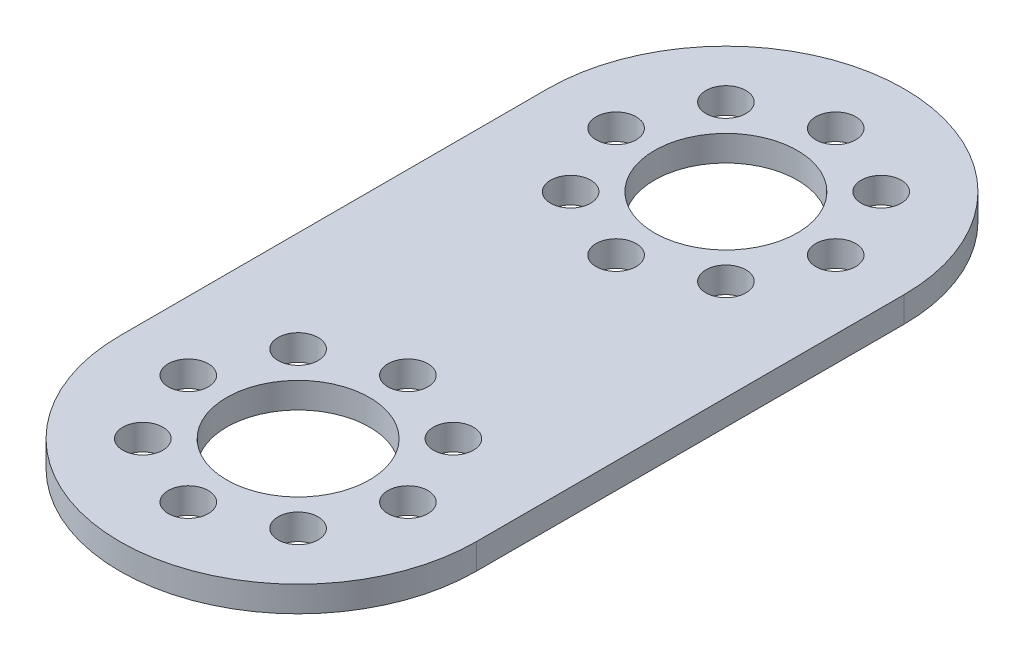
ISO-10303-21;
HEADER;
FILE_DESCRIPTION(('STEP AP214'),'2;1');
FILE_NAME('part.step','',(''),(''),'','','');
FILE_SCHEMA(('AUTOMOTIVE_DESIGN { 1 0 10303 214 1 1 1 1 }'));
ENDSEC;
DATA;
#1=APPLICATION_CONTEXT('core data for automotive mechanical design processes');
#2=APPLICATION_PROTOCOL_DEFINITION('international standard','automotive_design',2000,#1);
#3=PRODUCT_CONTEXT('',#1,'mechanical');
#4=PRODUCT('Part','Part','',(#3));
#5=PRODUCT_RELATED_PRODUCT_CATEGORY('part','',(#4));
#6=PRODUCT_DEFINITION_FORMATION('','',#4);
#7=PRODUCT_DEFINITION_CONTEXT('part definition',#1,'design');
#8=PRODUCT_DEFINITION('design','',#6,#7);
#9=PRODUCT_DEFINITION_SHAPE('','',#8);
#10=(LENGTH_UNIT() NAMED_UNIT(*) SI_UNIT(.MILLI.,.METRE.));
#11=(NAMED_UNIT(*) PLANE_ANGLE_UNIT() SI_UNIT($,.RADIAN.));
#12=(NAMED_UNIT(*) SI_UNIT($,.STERADIAN.) SOLID_ANGLE_UNIT());
#13=UNCERTAINTY_MEASURE_WITH_UNIT(LENGTH_MEASURE(1.E-05),#10,'distance_accuracy_value','');
#14=(GEOMETRIC_REPRESENTATION_CONTEXT(3) GLOBAL_UNCERTAINTY_ASSIGNED_CONTEXT((#13)) GLOBAL_UNIT_ASSIGNED_CONTEXT((#10,
#11,#12)) REPRESENTATION_CONTEXT('',''));
#15=CARTESIAN_POINT('',(0.,0.,0.));
#16=DIRECTION('',(0.,0.,1.));
#17=DIRECTION('',(1.,0.,0.));
#18=AXIS2_PLACEMENT_3D('',#15,#16,#17);
#19=CARTESIAN_POINT('',(0.,2.286,-19.05));
#20=DIRECTION('',(0.,-1.,0.));
#21=DIRECTION('',(0.,0.,-1.));
#22=AXIS2_PLACEMENT_3D('',#19,#20,#21);
#23=CYLINDRICAL_SURFACE('',#22,15.875);
#24=CARTESIAN_POINT('',(0.,0.,-19.05));
#25=DIRECTION('',(0.,-1.,0.));
#26=DIRECTION('',(0.,0.,-1.));
#27=AXIS2_PLACEMENT_3D('',#24,#25,#26);
#28=CIRCLE('',#27,15.875);
#29=CARTESIAN_POINT('',(-15.875,0.,-19.05));
#30=VERTEX_POINT('',#29);
#31=CARTESIAN_POINT('',(15.875,0.,-19.05));
#32=VERTEX_POINT('',#31);
#33=EDGE_CURVE('E100',#30,#32,#28,.T.);
#34=ORIENTED_EDGE('',*,*,#33,.F.);
#35=DIRECTION('',(0.,-1.,0.));
#36=VECTOR('',#35,1.);
#37=CARTESIAN_POINT('',(-15.875,2.286,-19.05));
#38=LINE('',#37,#36);
#39=CARTESIAN_POINT('',(-15.875,2.286,-19.05));
#40=VERTEX_POINT('',#39);
#41=EDGE_CURVE('E11',#40,#30,#38,.T.);
#42=ORIENTED_EDGE('',*,*,#41,.F.);
#43=CARTESIAN_POINT('',(0.,2.286,-19.05));
#44=DIRECTION('',(0.,-1.,0.));
#45=DIRECTION('',(0.,0.,-1.));
#46=AXIS2_PLACEMENT_3D('',#43,#44,#45);
#47=CIRCLE('',#46,15.875);
#48=CARTESIAN_POINT('',(15.875,2.286,-19.05));
#49=VERTEX_POINT('',#48);
#50=EDGE_CURVE('E93',#40,#49,#47,.T.);
#51=ORIENTED_EDGE('',*,*,#50,.T.);
#52=DIRECTION('',(0.,-1.,0.));
#53=VECTOR('',#52,1.);
#54=CARTESIAN_POINT('',(15.875,2.286,-19.05));
#55=LINE('',#54,#53);
#56=EDGE_CURVE('E38',#49,#32,#55,.T.);
#57=ORIENTED_EDGE('',*,*,#56,.T.);
#58=EDGE_LOOP('',(#34,#42,#51,#57));
#59=FACE_BOUND('',#58,.T.);
#60=ADVANCED_FACE('F35',(#59),#23,.T.);
#61=CARTESIAN_POINT('',(-15.875,2.286,19.05));
#62=DIRECTION('',(-1.,0.,0.));
#63=DIRECTION('',(0.,0.,1.));
#64=AXIS2_PLACEMENT_3D('',#61,#62,#63);
#65=PLANE('',#64);
#66=DIRECTION('',(0.,0.,-1.));
#67=VECTOR('',#66,1.);
#68=CARTESIAN_POINT('',(-15.875,0.,19.05));
#69=LINE('',#68,#67);
#70=CARTESIAN_POINT('',(-15.875,0.,19.05));
#71=VERTEX_POINT('',#70);
#72=EDGE_CURVE('E95',#71,#30,#69,.T.);
#73=ORIENTED_EDGE('',*,*,#72,.F.);
#74=DIRECTION('',(0.,-1.,0.));
#75=VECTOR('',#74,1.);
#76=CARTESIAN_POINT('',(-15.875,2.286,19.05));
#77=LINE('',#76,#75);
#78=CARTESIAN_POINT('',(-15.875,2.286,19.05));
#79=VERTEX_POINT('',#78);
#80=EDGE_CURVE('E44',#79,#71,#77,.T.);
#81=ORIENTED_EDGE('',*,*,#80,.F.);
#82=DIRECTION('',(0.,0.,-1.));
#83=VECTOR('',#82,1.);
#84=CARTESIAN_POINT('',(-15.875,2.286,19.05));
#85=LINE('',#84,#83);
#86=EDGE_CURVE('E90',#79,#40,#85,.T.);
#87=ORIENTED_EDGE('',*,*,#86,.T.);
#88=ORIENTED_EDGE('',*,*,#41,.T.);
#89=EDGE_LOOP('',(#73,#81,#87,#88));
#90=FACE_BOUND('',#89,.T.);
#91=ADVANCED_FACE('F111',(#90),#65,.T.);
#92=CARTESIAN_POINT('',(0.,2.286,19.05));
#93=DIRECTION('',(0.,-1.,0.));
#94=DIRECTION('',(0.,0.,-1.));
#95=AXIS2_PLACEMENT_3D('',#92,#93,#94);
#96=CYLINDRICAL_SURFACE('',#95,15.875);
#97=CARTESIAN_POINT('',(0.,0.,19.05));
#98=DIRECTION('',(0.,-1.,0.));
#99=DIRECTION('',(0.,0.,-1.));
#100=AXIS2_PLACEMENT_3D('',#97,#98,#99);
#101=CIRCLE('',#100,15.875);
#102=CARTESIAN_POINT('',(15.875,0.,19.05));
#103=VERTEX_POINT('',#102);
#104=EDGE_CURVE('E85',#103,#71,#101,.T.);
#105=ORIENTED_EDGE('',*,*,#104,.F.);
#106=DIRECTION('',(0.,-1.,0.));
#107=VECTOR('',#106,1.);
#108=CARTESIAN_POINT('',(15.875,2.286,19.05));
#109=LINE('',#108,#107);
#110=CARTESIAN_POINT('',(15.875,2.286,19.05));
#111=VERTEX_POINT('',#110);
#112=EDGE_CURVE('E80',#111,#103,#109,.T.);
#113=ORIENTED_EDGE('',*,*,#112,.F.);
#114=CARTESIAN_POINT('',(0.,2.286,19.05));
#115=DIRECTION('',(0.,-1.,0.));
#116=DIRECTION('',(0.,0.,-1.));
#117=AXIS2_PLACEMENT_3D('',#114,#115,#116);
#118=CIRCLE('',#117,15.875);
#119=EDGE_CURVE('E83',#111,#79,#118,.T.);
#120=ORIENTED_EDGE('',*,*,#119,.T.);
#121=ORIENTED_EDGE('',*,*,#80,.T.);
#122=EDGE_LOOP('',(#105,#113,#120,#121));
#123=FACE_BOUND('',#122,.T.);
#124=ADVANCED_FACE('F82',(#123),#96,.T.);
#125=CARTESIAN_POINT('',(15.875,2.286,-19.05));
#126=DIRECTION('',(1.,0.,0.));
#127=DIRECTION('',(0.,0.,-1.));
#128=AXIS2_PLACEMENT_3D('',#125,#126,#127);
#129=PLANE('',#128);
#130=DIRECTION('',(0.,0.,1.));
#131=VECTOR('',#130,1.);
#132=CARTESIAN_POINT('',(15.875,0.,-19.05));
#133=LINE('',#132,#131);
#134=EDGE_CURVE('E103',#32,#103,#133,.T.);
#135=ORIENTED_EDGE('',*,*,#134,.F.);
#136=ORIENTED_EDGE('',*,*,#56,.F.);
#137=DIRECTION('',(0.,0.,1.));
#138=VECTOR('',#137,1.);
#139=CARTESIAN_POINT('',(15.875,2.286,-19.05));
#140=LINE('',#139,#138);
#141=EDGE_CURVE('E89',#49,#111,#140,.T.);
#142=ORIENTED_EDGE('',*,*,#141,.T.);
#143=ORIENTED_EDGE('',*,*,#112,.T.);
#144=EDGE_LOOP('',(#135,#136,#142,#143));
#145=FACE_BOUND('',#144,.T.);
#146=ADVANCED_FACE('F92',(#145),#129,.T.);
#147=CARTESIAN_POINT('',(0.,2.286,-19.05));
#148=DIRECTION('',(0.,-1.,0.));
#149=DIRECTION('',(0.,0.,-1.));
#150=AXIS2_PLACEMENT_3D('',#147,#148,#149);
#151=PLANE('',#150);
#152=CARTESIAN_POINT('',(6.91479721322333,2.286,-25.9647972132232));
#153=DIRECTION('',(0.,-1.,0.));
#154=DIRECTION('',(0.,0.,1.));
#155=AXIS2_PLACEMENT_3D('',#152,#153,#154);
#156=CIRCLE('',#155,1.78435);
#157=CARTESIAN_POINT('',(6.91479721322333,2.286,-24.1804472132232));
#158=VERTEX_POINT('',#157);
#159=EDGE_CURVE('E208',#158,#158,#156,.T.);
#160=ORIENTED_EDGE('',*,*,#159,.T.);
#161=EDGE_LOOP('',(#160));
#162=FACE_BOUND('',#161,.T.);
#163=CARTESIAN_POINT('',(1.04083408558608E-13,2.286,-28.829));
#164=DIRECTION('',(0.,-1.,0.));
#165=DIRECTION('',(0.,0.,1.));
#166=AXIS2_PLACEMENT_3D('',#163,#164,#165);
#167=CIRCLE('',#166,1.78435);
#168=CARTESIAN_POINT('',(1.04083408558608E-13,2.286,-27.04465));
#169=VERTEX_POINT('',#168);
#170=EDGE_CURVE('E216',#169,#169,#167,.T.);
#171=ORIENTED_EDGE('',*,*,#170,.T.);
#172=EDGE_LOOP('',(#171));
#173=FACE_BOUND('',#172,.T.);
#174=CARTESIAN_POINT('',(-6.91479721322319,2.286,-25.9647972132233));
#175=DIRECTION('',(0.,-1.,0.));
#176=DIRECTION('',(0.,0.,1.));
#177=AXIS2_PLACEMENT_3D('',#174,#175,#176);
#178=CIRCLE('',#177,1.78435);
#179=CARTESIAN_POINT('',(-6.91479721322319,2.286,-24.1804472132233));
#180=VERTEX_POINT('',#179);
#181=EDGE_CURVE('E222',#180,#180,#178,.T.);
#182=ORIENTED_EDGE('',*,*,#181,.T.);
#183=EDGE_LOOP('',(#182));
#184=FACE_BOUND('',#183,.T.);
#185=CARTESIAN_POINT('',(-9.779,2.286,-19.05));
#186=DIRECTION('',(0.,-1.,0.));
#187=DIRECTION('',(0.,0.,1.));
#188=AXIS2_PLACEMENT_3D('',#185,#186,#187);
#189=CIRCLE('',#188,1.78435);
#190=CARTESIAN_POINT('',(-9.779,2.286,-17.26565));
#191=VERTEX_POINT('',#190);
#192=EDGE_CURVE('E228',#191,#191,#189,.T.);
#193=ORIENTED_EDGE('',*,*,#192,.T.);
#194=EDGE_LOOP('',(#193));
#195=FACE_BOUND('',#194,.T.);
#196=CARTESIAN_POINT('',(-6.91479721322328,2.286,-12.1352027867768));
#197=DIRECTION('',(0.,-1.,0.));
#198=DIRECTION('',(0.,0.,1.));
#199=AXIS2_PLACEMENT_3D('',#196,#197,#198);
#200=CIRCLE('',#199,1.78435);
#201=CARTESIAN_POINT('',(-6.91479721322328,2.286,-10.3508527867768));
#202=VERTEX_POINT('',#201);
#203=EDGE_CURVE('E234',#202,#202,#200,.T.);
#204=ORIENTED_EDGE('',*,*,#203,.T.);
#205=EDGE_LOOP('',(#204));
#206=FACE_BOUND('',#205,.T.);
#207=CARTESIAN_POINT('',(0.,2.286,-9.271));
#208=DIRECTION('',(0.,-1.,0.));
#209=DIRECTION('',(0.,0.,1.));
#210=AXIS2_PLACEMENT_3D('',#207,#208,#209);
#211=CIRCLE('',#210,1.78435);
#212=CARTESIAN_POINT('',(0.,2.286,-7.48665));
#213=VERTEX_POINT('',#212);
#214=EDGE_CURVE('E240',#213,#213,#211,.T.);
#215=ORIENTED_EDGE('',*,*,#214,.T.);
#216=EDGE_LOOP('',(#215));
#217=FACE_BOUND('',#216,.T.);
#218=CARTESIAN_POINT('',(6.91479721322324,2.286,-12.1352027867767));
#219=DIRECTION('',(0.,-1.,0.));
#220=DIRECTION('',(0.,0.,1.));
#221=AXIS2_PLACEMENT_3D('',#218,#219,#220);
#222=CIRCLE('',#221,1.78435);
#223=CARTESIAN_POINT('',(6.91479721322324,2.286,-10.3508527867767));
#224=VERTEX_POINT('',#223);
#225=EDGE_CURVE('E246',#224,#224,#222,.T.);
#226=ORIENTED_EDGE('',*,*,#225,.T.);
#227=EDGE_LOOP('',(#226));
#228=FACE_BOUND('',#227,.T.);
#229=CARTESIAN_POINT('',(9.779,2.286,-19.05));
#230=DIRECTION('',(0.,-1.,0.));
#231=DIRECTION('',(0.,0.,1.));
#232=AXIS2_PLACEMENT_3D('',#229,#230,#231);
#233=CIRCLE('',#232,1.78435);
#234=CARTESIAN_POINT('',(9.779,2.286,-17.26565));
#235=VERTEX_POINT('',#234);
#236=EDGE_CURVE('E252',#235,#235,#233,.T.);
#237=ORIENTED_EDGE('',*,*,#236,.T.);
#238=EDGE_LOOP('',(#237));
#239=FACE_BOUND('',#238,.T.);
#240=CARTESIAN_POINT('',(6.91479721322333,2.286,25.9647972132232));
#241=DIRECTION('',(0.,-1.,0.));
#242=DIRECTION('',(0.,0.,1.));
#243=AXIS2_PLACEMENT_3D('',#240,#241,#242);
#244=CIRCLE('',#243,1.78435);
#245=CARTESIAN_POINT('',(6.91479721322333,2.286,27.7491472132232));
#246=VERTEX_POINT('',#245);
#247=EDGE_CURVE('E258',#246,#246,#244,.T.);
#248=ORIENTED_EDGE('',*,*,#247,.T.);
#249=EDGE_LOOP('',(#248));
#250=FACE_BOUND('',#249,.T.);
#251=CARTESIAN_POINT('',(1.04083408558608E-13,2.286,28.829));
#252=DIRECTION('',(0.,-1.,0.));
#253=DIRECTION('',(0.,0.,1.));
#254=AXIS2_PLACEMENT_3D('',#251,#252,#253);
#255=CIRCLE('',#254,1.78435);
#256=CARTESIAN_POINT('',(1.04083408558608E-13,2.286,30.61335));
#257=VERTEX_POINT('',#256);
#258=EDGE_CURVE('E264',#257,#257,#255,.T.);
#259=ORIENTED_EDGE('',*,*,#258,.T.);
#260=EDGE_LOOP('',(#259));
#261=FACE_BOUND('',#260,.T.);
#262=CARTESIAN_POINT('',(-6.91479721322319,2.286,25.9647972132233));
#263=DIRECTION('',(0.,-1.,0.));
#264=DIRECTION('',(0.,0.,1.));
#265=AXIS2_PLACEMENT_3D('',#262,#263,#264);
#266=CIRCLE('',#265,1.78435);
#267=CARTESIAN_POINT('',(-6.91479721322319,2.286,27.7491472132233));
#268=VERTEX_POINT('',#267);
#269=EDGE_CURVE('E270',#268,#268,#266,.T.);
#270=ORIENTED_EDGE('',*,*,#269,.T.);
#271=EDGE_LOOP('',(#270));
#272=FACE_BOUND('',#271,.T.);
#273=CARTESIAN_POINT('',(-9.779,2.286,19.05));
#274=DIRECTION('',(0.,-1.,0.));
#275=DIRECTION('',(0.,0.,1.));
#276=AXIS2_PLACEMENT_3D('',#273,#274,#275);
#277=CIRCLE('',#276,1.78435);
#278=CARTESIAN_POINT('',(-9.779,2.286,20.83435));
#279=VERTEX_POINT('',#278);
#280=EDGE_CURVE('E276',#279,#279,#277,.T.);
#281=ORIENTED_EDGE('',*,*,#280,.T.);
#282=EDGE_LOOP('',(#281));
#283=FACE_BOUND('',#282,.T.);
#284=CARTESIAN_POINT('',(-6.91479721322328,2.286,12.1352027867768));
#285=DIRECTION('',(0.,-1.,0.));
#286=DIRECTION('',(0.,0.,1.));
#287=AXIS2_PLACEMENT_3D('',#284,#285,#286);
#288=CIRCLE('',#287,1.78435);
#289=CARTESIAN_POINT('',(-6.91479721322328,2.286,13.9195527867768));
#290=VERTEX_POINT('',#289);
#291=EDGE_CURVE('E282',#290,#290,#288,.T.);
#292=ORIENTED_EDGE('',*,*,#291,.T.);
#293=EDGE_LOOP('',(#292));
#294=FACE_BOUND('',#293,.T.);
#295=CARTESIAN_POINT('',(0.,2.286,9.271));
#296=DIRECTION('',(0.,-1.,0.));
#297=DIRECTION('',(0.,0.,1.));
#298=AXIS2_PLACEMENT_3D('',#295,#296,#297);
#299=CIRCLE('',#298,1.78435);
#300=CARTESIAN_POINT('',(0.,2.286,11.05535));
#301=VERTEX_POINT('',#300);
#302=EDGE_CURVE('E288',#301,#301,#299,.T.);
#303=ORIENTED_EDGE('',*,*,#302,.T.);
#304=EDGE_LOOP('',(#303));
#305=FACE_BOUND('',#304,.T.);
#306=CARTESIAN_POINT('',(6.91479721322324,2.286,12.1352027867767));
#307=DIRECTION('',(0.,-1.,0.));
#308=DIRECTION('',(0.,0.,1.));
#309=AXIS2_PLACEMENT_3D('',#306,#307,#308);
#310=CIRCLE('',#309,1.78435);
#311=CARTESIAN_POINT('',(6.91479721322324,2.286,13.9195527867767));
#312=VERTEX_POINT('',#311);
#313=EDGE_CURVE('E294',#312,#312,#310,.T.);
#314=ORIENTED_EDGE('',*,*,#313,.T.);
#315=EDGE_LOOP('',(#314));
#316=FACE_BOUND('',#315,.T.);
#317=CARTESIAN_POINT('',(9.779,2.286,19.05));
#318=DIRECTION('',(0.,-1.,0.));
#319=DIRECTION('',(0.,0.,1.));
#320=AXIS2_PLACEMENT_3D('',#317,#318,#319);
#321=CIRCLE('',#320,1.78435);
#322=CARTESIAN_POINT('',(9.779,2.286,20.83435));
#323=VERTEX_POINT('',#322);
#324=EDGE_CURVE('E300',#323,#323,#321,.T.);
#325=ORIENTED_EDGE('',*,*,#324,.T.);
#326=EDGE_LOOP('',(#325));
#327=FACE_BOUND('',#326,.T.);
#328=CARTESIAN_POINT('',(0.,2.286,19.05));
#329=DIRECTION('',(0.,-1.,0.));
#330=DIRECTION('',(0.,0.,1.));
#331=AXIS2_PLACEMENT_3D('',#328,#329,#330);
#332=CIRCLE('',#331,6.3627);
#333=CARTESIAN_POINT('',(0.,2.286,25.4127));
#334=VERTEX_POINT('',#333);
#335=EDGE_CURVE('E306',#334,#334,#332,.T.);
#336=ORIENTED_EDGE('',*,*,#335,.T.);
#337=EDGE_LOOP('',(#336));
#338=FACE_BOUND('',#337,.T.);
#339=CARTESIAN_POINT('',(0.,2.286,-19.05));
#340=DIRECTION('',(0.,-1.,0.));
#341=DIRECTION('',(0.,0.,1.));
#342=AXIS2_PLACEMENT_3D('',#339,#340,#341);
#343=CIRCLE('',#342,6.3627);
#344=CARTESIAN_POINT('',(0.,2.286,-12.6873));
#345=VERTEX_POINT('',#344);
#346=EDGE_CURVE('E104',#345,#345,#343,.T.);
#347=ORIENTED_EDGE('',*,*,#346,.T.);
#348=EDGE_LOOP('',(#347));
#349=FACE_BOUND('',#348,.T.);
#350=ORIENTED_EDGE('',*,*,#50,.F.);
#351=ORIENTED_EDGE('',*,*,#86,.F.);
#352=ORIENTED_EDGE('',*,*,#119,.F.);
#353=ORIENTED_EDGE('',*,*,#141,.F.);
#354=EDGE_LOOP('',(#350,#351,#352,#353));
#355=FACE_BOUND('',#354,.T.);
#356=ADVANCED_FACE('F88',(#162,#173,#184,#195,#206,#217,#228,#239,#250,#261,#272,#283,#294,#305,
#316,#327,#338,#349,#355),#151,.F.);
#357=CARTESIAN_POINT('',(0.,0.,-19.05));
#358=DIRECTION('',(0.,-1.,0.));
#359=DIRECTION('',(0.,0.,-1.));
#360=AXIS2_PLACEMENT_3D('',#357,#358,#359);
#361=PLANE('',#360);
#362=CARTESIAN_POINT('',(6.91479721322333,0.,-25.9647972132232));
#363=DIRECTION('',(0.,-1.,0.));
#364=DIRECTION('',(0.,0.,1.));
#365=AXIS2_PLACEMENT_3D('',#362,#363,#364);
#366=CIRCLE('',#365,1.78435);
#367=CARTESIAN_POINT('',(6.91479721322333,0.,-24.1804472132232));
#368=VERTEX_POINT('',#367);
#369=EDGE_CURVE('E211',#368,#368,#366,.T.);
#370=ORIENTED_EDGE('',*,*,#369,.F.);
#371=EDGE_LOOP('',(#370));
#372=FACE_BOUND('',#371,.T.);
#373=CARTESIAN_POINT('',(1.04083408558608E-13,0.,-28.829));
#374=DIRECTION('',(0.,-1.,0.));
#375=DIRECTION('',(0.,0.,1.));
#376=AXIS2_PLACEMENT_3D('',#373,#374,#375);
#377=CIRCLE('',#376,1.78435);
#378=CARTESIAN_POINT('',(1.04083408558608E-13,0.,-27.04465));
#379=VERTEX_POINT('',#378);
#380=EDGE_CURVE('E213',#379,#379,#377,.T.);
#381=ORIENTED_EDGE('',*,*,#380,.F.);
#382=EDGE_LOOP('',(#381));
#383=FACE_BOUND('',#382,.T.);
#384=CARTESIAN_POINT('',(-6.91479721322319,0.,-25.9647972132233));
#385=DIRECTION('',(0.,-1.,0.));
#386=DIRECTION('',(0.,0.,1.));
#387=AXIS2_PLACEMENT_3D('',#384,#385,#386);
#388=CIRCLE('',#387,1.78435);
#389=CARTESIAN_POINT('',(-6.91479721322319,0.,-24.1804472132233));
#390=VERTEX_POINT('',#389);
#391=EDGE_CURVE('E219',#390,#390,#388,.T.);
#392=ORIENTED_EDGE('',*,*,#391,.F.);
#393=EDGE_LOOP('',(#392));
#394=FACE_BOUND('',#393,.T.);
#395=CARTESIAN_POINT('',(-9.779,0.,-19.05));
#396=DIRECTION('',(0.,-1.,0.));
#397=DIRECTION('',(0.,0.,1.));
#398=AXIS2_PLACEMENT_3D('',#395,#396,#397);
#399=CIRCLE('',#398,1.78435);
#400=CARTESIAN_POINT('',(-9.779,0.,-17.26565));
#401=VERTEX_POINT('',#400);
#402=EDGE_CURVE('E225',#401,#401,#399,.T.);
#403=ORIENTED_EDGE('',*,*,#402,.F.);
#404=EDGE_LOOP('',(#403));
#405=FACE_BOUND('',#404,.T.);
#406=CARTESIAN_POINT('',(-6.91479721322328,0.,-12.1352027867768));
#407=DIRECTION('',(0.,-1.,0.));
#408=DIRECTION('',(0.,0.,1.));
#409=AXIS2_PLACEMENT_3D('',#406,#407,#408);
#410=CIRCLE('',#409,1.78435);
#411=CARTESIAN_POINT('',(-6.91479721322328,0.,-10.3508527867768));
#412=VERTEX_POINT('',#411);
#413=EDGE_CURVE('E231',#412,#412,#410,.T.);
#414=ORIENTED_EDGE('',*,*,#413,.F.);
#415=EDGE_LOOP('',(#414));
#416=FACE_BOUND('',#415,.T.);
#417=CARTESIAN_POINT('',(0.,0.,-9.271));
#418=DIRECTION('',(0.,-1.,0.));
#419=DIRECTION('',(0.,0.,1.));
#420=AXIS2_PLACEMENT_3D('',#417,#418,#419);
#421=CIRCLE('',#420,1.78435);
#422=CARTESIAN_POINT('',(0.,0.,-7.48665));
#423=VERTEX_POINT('',#422);
#424=EDGE_CURVE('E237',#423,#423,#421,.T.);
#425=ORIENTED_EDGE('',*,*,#424,.F.);
#426=EDGE_LOOP('',(#425));
#427=FACE_BOUND('',#426,.T.);
#428=CARTESIAN_POINT('',(6.91479721322324,0.,-12.1352027867767));
#429=DIRECTION('',(0.,-1.,0.));
#430=DIRECTION('',(0.,0.,1.));
#431=AXIS2_PLACEMENT_3D('',#428,#429,#430);
#432=CIRCLE('',#431,1.78435);
#433=CARTESIAN_POINT('',(6.91479721322324,0.,-10.3508527867767));
#434=VERTEX_POINT('',#433);
#435=EDGE_CURVE('E243',#434,#434,#432,.T.);
#436=ORIENTED_EDGE('',*,*,#435,.F.);
#437=EDGE_LOOP('',(#436));
#438=FACE_BOUND('',#437,.T.);
#439=CARTESIAN_POINT('',(9.779,0.,-19.05));
#440=DIRECTION('',(0.,-1.,0.));
#441=DIRECTION('',(0.,0.,1.));
#442=AXIS2_PLACEMENT_3D('',#439,#440,#441);
#443=CIRCLE('',#442,1.78435);
#444=CARTESIAN_POINT('',(9.779,0.,-17.26565));
#445=VERTEX_POINT('',#444);
#446=EDGE_CURVE('E249',#445,#445,#443,.T.);
#447=ORIENTED_EDGE('',*,*,#446,.F.);
#448=EDGE_LOOP('',(#447));
#449=FACE_BOUND('',#448,.T.);
#450=CARTESIAN_POINT('',(6.91479721322333,0.,25.9647972132232));
#451=DIRECTION('',(0.,-1.,0.));
#452=DIRECTION('',(0.,0.,1.));
#453=AXIS2_PLACEMENT_3D('',#450,#451,#452);
#454=CIRCLE('',#453,1.78435);
#455=CARTESIAN_POINT('',(6.91479721322333,0.,27.7491472132232));
#456=VERTEX_POINT('',#455);
#457=EDGE_CURVE('E255',#456,#456,#454,.T.);
#458=ORIENTED_EDGE('',*,*,#457,.F.);
#459=EDGE_LOOP('',(#458));
#460=FACE_BOUND('',#459,.T.);
#461=CARTESIAN_POINT('',(1.04083408558608E-13,0.,28.829));
#462=DIRECTION('',(0.,-1.,0.));
#463=DIRECTION('',(0.,0.,1.));
#464=AXIS2_PLACEMENT_3D('',#461,#462,#463);
#465=CIRCLE('',#464,1.78435);
#466=CARTESIAN_POINT('',(1.04083408558608E-13,0.,30.61335));
#467=VERTEX_POINT('',#466);
#468=EDGE_CURVE('E261',#467,#467,#465,.T.);
#469=ORIENTED_EDGE('',*,*,#468,.F.);
#470=EDGE_LOOP('',(#469));
#471=FACE_BOUND('',#470,.T.);
#472=CARTESIAN_POINT('',(-6.91479721322319,0.,25.9647972132233));
#473=DIRECTION('',(0.,-1.,0.));
#474=DIRECTION('',(0.,0.,1.));
#475=AXIS2_PLACEMENT_3D('',#472,#473,#474);
#476=CIRCLE('',#475,1.78435);
#477=CARTESIAN_POINT('',(-6.91479721322319,0.,27.7491472132233));
#478=VERTEX_POINT('',#477);
#479=EDGE_CURVE('E267',#478,#478,#476,.T.);
#480=ORIENTED_EDGE('',*,*,#479,.F.);
#481=EDGE_LOOP('',(#480));
#482=FACE_BOUND('',#481,.T.);
#483=CARTESIAN_POINT('',(-9.779,0.,19.05));
#484=DIRECTION('',(0.,-1.,0.));
#485=DIRECTION('',(0.,0.,1.));
#486=AXIS2_PLACEMENT_3D('',#483,#484,#485);
#487=CIRCLE('',#486,1.78435);
#488=CARTESIAN_POINT('',(-9.779,0.,20.83435));
#489=VERTEX_POINT('',#488);
#490=EDGE_CURVE('E273',#489,#489,#487,.T.);
#491=ORIENTED_EDGE('',*,*,#490,.F.);
#492=EDGE_LOOP('',(#491));
#493=FACE_BOUND('',#492,.T.);
#494=CARTESIAN_POINT('',(-6.91479721322328,0.,12.1352027867768));
#495=DIRECTION('',(0.,-1.,0.));
#496=DIRECTION('',(0.,0.,1.));
#497=AXIS2_PLACEMENT_3D('',#494,#495,#496);
#498=CIRCLE('',#497,1.78435);
#499=CARTESIAN_POINT('',(-6.91479721322328,0.,13.9195527867768));
#500=VERTEX_POINT('',#499);
#501=EDGE_CURVE('E279',#500,#500,#498,.T.);
#502=ORIENTED_EDGE('',*,*,#501,.F.);
#503=EDGE_LOOP('',(#502));
#504=FACE_BOUND('',#503,.T.);
#505=CARTESIAN_POINT('',(0.,0.,9.271));
#506=DIRECTION('',(0.,-1.,0.));
#507=DIRECTION('',(0.,0.,1.));
#508=AXIS2_PLACEMENT_3D('',#505,#506,#507);
#509=CIRCLE('',#508,1.78435);
#510=CARTESIAN_POINT('',(0.,0.,11.05535));
#511=VERTEX_POINT('',#510);
#512=EDGE_CURVE('E285',#511,#511,#509,.T.);
#513=ORIENTED_EDGE('',*,*,#512,.F.);
#514=EDGE_LOOP('',(#513));
#515=FACE_BOUND('',#514,.T.);
#516=CARTESIAN_POINT('',(6.91479721322324,0.,12.1352027867767));
#517=DIRECTION('',(0.,-1.,0.));
#518=DIRECTION('',(0.,0.,1.));
#519=AXIS2_PLACEMENT_3D('',#516,#517,#518);
#520=CIRCLE('',#519,1.78435);
#521=CARTESIAN_POINT('',(6.91479721322324,0.,13.9195527867767));
#522=VERTEX_POINT('',#521);
#523=EDGE_CURVE('E291',#522,#522,#520,.T.);
#524=ORIENTED_EDGE('',*,*,#523,.F.);
#525=EDGE_LOOP('',(#524));
#526=FACE_BOUND('',#525,.T.);
#527=CARTESIAN_POINT('',(9.779,0.,19.05));
#528=DIRECTION('',(0.,-1.,0.));
#529=DIRECTION('',(0.,0.,1.));
#530=AXIS2_PLACEMENT_3D('',#527,#528,#529);
#531=CIRCLE('',#530,1.78435);
#532=CARTESIAN_POINT('',(9.779,0.,20.83435));
#533=VERTEX_POINT('',#532);
#534=EDGE_CURVE('E297',#533,#533,#531,.T.);
#535=ORIENTED_EDGE('',*,*,#534,.F.);
#536=EDGE_LOOP('',(#535));
#537=FACE_BOUND('',#536,.T.);
#538=CARTESIAN_POINT('',(0.,0.,19.05));
#539=DIRECTION('',(0.,-1.,0.));
#540=DIRECTION('',(0.,0.,1.));
#541=AXIS2_PLACEMENT_3D('',#538,#539,#540);
#542=CIRCLE('',#541,6.3627);
#543=CARTESIAN_POINT('',(0.,0.,25.4127));
#544=VERTEX_POINT('',#543);
#545=EDGE_CURVE('E303',#544,#544,#542,.T.);
#546=ORIENTED_EDGE('',*,*,#545,.F.);
#547=EDGE_LOOP('',(#546));
#548=FACE_BOUND('',#547,.T.);
#549=CARTESIAN_POINT('',(0.,0.,-19.05));
#550=DIRECTION('',(0.,-1.,0.));
#551=DIRECTION('',(0.,0.,1.));
#552=AXIS2_PLACEMENT_3D('',#549,#550,#551);
#553=CIRCLE('',#552,6.3627);
#554=CARTESIAN_POINT('',(0.,0.,-12.6873));
#555=VERTEX_POINT('',#554);
#556=EDGE_CURVE('E309',#555,#555,#553,.T.);
#557=ORIENTED_EDGE('',*,*,#556,.F.);
#558=EDGE_LOOP('',(#557));
#559=FACE_BOUND('',#558,.T.);
#560=ORIENTED_EDGE('',*,*,#33,.T.);
#561=ORIENTED_EDGE('',*,*,#134,.T.);
#562=ORIENTED_EDGE('',*,*,#104,.T.);
#563=ORIENTED_EDGE('',*,*,#72,.T.);
#564=EDGE_LOOP('',(#560,#561,#562,#563));
#565=FACE_BOUND('',#564,.T.);
#566=ADVANCED_FACE('F110',(#372,#383,#394,#405,#416,#427,#438,#449,#460,#471,#482,#493,#504,
#515,#526,#537,#548,#559,#565),#361,.T.);
#567=CARTESIAN_POINT('',(0.,2.286,-19.05));
#568=DIRECTION('',(0.,-1.,0.));
#569=DIRECTION('',(0.,0.,-1.));
#570=AXIS2_PLACEMENT_3D('',#567,#568,#569);
#571=CYLINDRICAL_SURFACE('',#570,6.3627);
#572=ORIENTED_EDGE('',*,*,#346,.F.);
#573=EDGE_LOOP('',(#572));
#574=FACE_BOUND('',#573,.T.);
#575=ORIENTED_EDGE('',*,*,#556,.T.);
#576=EDGE_LOOP('',(#575));
#577=FACE_BOUND('',#576,.T.);
#578=ADVANCED_FACE('F129',(#574,#577),#571,.F.);
#579=CARTESIAN_POINT('',(0.,2.286,19.05));
#580=DIRECTION('',(0.,-1.,0.));
#581=DIRECTION('',(0.,0.,-1.));
#582=AXIS2_PLACEMENT_3D('',#579,#580,#581);
#583=CYLINDRICAL_SURFACE('',#582,6.3627);
#584=ORIENTED_EDGE('',*,*,#335,.F.);
#585=EDGE_LOOP('',(#584));
#586=FACE_BOUND('',#585,.T.);
#587=ORIENTED_EDGE('',*,*,#545,.T.);
#588=EDGE_LOOP('',(#587));
#589=FACE_BOUND('',#588,.T.);
#590=ADVANCED_FACE('F136',(#586,#589),#583,.F.);
#591=CARTESIAN_POINT('',(9.779,2.286,19.05));
#592=DIRECTION('',(0.,-1.,0.));
#593=DIRECTION('',(0.,0.,-1.));
#594=AXIS2_PLACEMENT_3D('',#591,#592,#593);
#595=CYLINDRICAL_SURFACE('',#594,1.78435);
#596=ORIENTED_EDGE('',*,*,#324,.F.);
#597=EDGE_LOOP('',(#596));
#598=FACE_BOUND('',#597,.T.);
#599=ORIENTED_EDGE('',*,*,#534,.T.);
#600=EDGE_LOOP('',(#599));
#601=FACE_BOUND('',#600,.T.);
#602=ADVANCED_FACE('F140',(#598,#601),#595,.F.);
#603=CARTESIAN_POINT('',(6.91479721322324,2.286,12.1352027867767));
#604=DIRECTION('',(0.,-1.,0.));
#605=DIRECTION('',(0.,0.,-1.));
#606=AXIS2_PLACEMENT_3D('',#603,#604,#605);
#607=CYLINDRICAL_SURFACE('',#606,1.78435);
#608=ORIENTED_EDGE('',*,*,#313,.F.);
#609=EDGE_LOOP('',(#608));
#610=FACE_BOUND('',#609,.T.);
#611=ORIENTED_EDGE('',*,*,#523,.T.);
#612=EDGE_LOOP('',(#611));
#613=FACE_BOUND('',#612,.T.);
#614=ADVANCED_FACE('F144',(#610,#613),#607,.F.);
#615=CARTESIAN_POINT('',(0.,2.286,9.271));
#616=DIRECTION('',(0.,-1.,0.));
#617=DIRECTION('',(0.,0.,-1.));
#618=AXIS2_PLACEMENT_3D('',#615,#616,#617);
#619=CYLINDRICAL_SURFACE('',#618,1.78435);
#620=ORIENTED_EDGE('',*,*,#302,.F.);
#621=EDGE_LOOP('',(#620));
#622=FACE_BOUND('',#621,.T.);
#623=ORIENTED_EDGE('',*,*,#512,.T.);
#624=EDGE_LOOP('',(#623));
#625=FACE_BOUND('',#624,.T.);
#626=ADVANCED_FACE('F148',(#622,#625),#619,.F.);
#627=CARTESIAN_POINT('',(-6.91479721322328,2.286,12.1352027867768));
#628=DIRECTION('',(0.,-1.,0.));
#629=DIRECTION('',(0.,0.,-1.));
#630=AXIS2_PLACEMENT_3D('',#627,#628,#629);
#631=CYLINDRICAL_SURFACE('',#630,1.78435);
#632=ORIENTED_EDGE('',*,*,#291,.F.);
#633=EDGE_LOOP('',(#632));
#634=FACE_BOUND('',#633,.T.);
#635=ORIENTED_EDGE('',*,*,#501,.T.);
#636=EDGE_LOOP('',(#635));
#637=FACE_BOUND('',#636,.T.);
#638=ADVANCED_FACE('F152',(#634,#637),#631,.F.);
#639=CARTESIAN_POINT('',(-9.779,2.286,19.05));
#640=DIRECTION('',(0.,-1.,0.));
#641=DIRECTION('',(0.,0.,-1.));
#642=AXIS2_PLACEMENT_3D('',#639,#640,#641);
#643=CYLINDRICAL_SURFACE('',#642,1.78435);
#644=ORIENTED_EDGE('',*,*,#280,.F.);
#645=EDGE_LOOP('',(#644));
#646=FACE_BOUND('',#645,.T.);
#647=ORIENTED_EDGE('',*,*,#490,.T.);
#648=EDGE_LOOP('',(#647));
#649=FACE_BOUND('',#648,.T.);
#650=ADVANCED_FACE('F156',(#646,#649),#643,.F.);
#651=CARTESIAN_POINT('',(-6.91479721322319,2.286,25.9647972132233));
#652=DIRECTION('',(0.,-1.,0.));
#653=DIRECTION('',(0.,0.,-1.));
#654=AXIS2_PLACEMENT_3D('',#651,#652,#653);
#655=CYLINDRICAL_SURFACE('',#654,1.78435);
#656=ORIENTED_EDGE('',*,*,#269,.F.);
#657=EDGE_LOOP('',(#656));
#658=FACE_BOUND('',#657,.T.);
#659=ORIENTED_EDGE('',*,*,#479,.T.);
#660=EDGE_LOOP('',(#659));
#661=FACE_BOUND('',#660,.T.);
#662=ADVANCED_FACE('F160',(#658,#661),#655,.F.);
#663=CARTESIAN_POINT('',(1.04083408558608E-13,2.286,28.829));
#664=DIRECTION('',(0.,-1.,0.));
#665=DIRECTION('',(0.,0.,-1.));
#666=AXIS2_PLACEMENT_3D('',#663,#664,#665);
#667=CYLINDRICAL_SURFACE('',#666,1.78435);
#668=ORIENTED_EDGE('',*,*,#258,.F.);
#669=EDGE_LOOP('',(#668));
#670=FACE_BOUND('',#669,.T.);
#671=ORIENTED_EDGE('',*,*,#468,.T.);
#672=EDGE_LOOP('',(#671));
#673=FACE_BOUND('',#672,.T.);
#674=ADVANCED_FACE('F164',(#670,#673),#667,.F.);
#675=CARTESIAN_POINT('',(6.91479721322333,2.286,25.9647972132232));
#676=DIRECTION('',(0.,-1.,0.));
#677=DIRECTION('',(0.,0.,-1.));
#678=AXIS2_PLACEMENT_3D('',#675,#676,#677);
#679=CYLINDRICAL_SURFACE('',#678,1.78435);
#680=ORIENTED_EDGE('',*,*,#247,.F.);
#681=EDGE_LOOP('',(#680));
#682=FACE_BOUND('',#681,.T.);
#683=ORIENTED_EDGE('',*,*,#457,.T.);
#684=EDGE_LOOP('',(#683));
#685=FACE_BOUND('',#684,.T.);
#686=ADVANCED_FACE('F168',(#682,#685),#679,.F.);
#687=CARTESIAN_POINT('',(9.779,2.286,-19.05));
#688=DIRECTION('',(0.,-1.,0.));
#689=DIRECTION('',(0.,0.,-1.));
#690=AXIS2_PLACEMENT_3D('',#687,#688,#689);
#691=CYLINDRICAL_SURFACE('',#690,1.78435);
#692=ORIENTED_EDGE('',*,*,#236,.F.);
#693=EDGE_LOOP('',(#692));
#694=FACE_BOUND('',#693,.T.);
#695=ORIENTED_EDGE('',*,*,#446,.T.);
#696=EDGE_LOOP('',(#695));
#697=FACE_BOUND('',#696,.T.);
#698=ADVANCED_FACE('F172',(#694,#697),#691,.F.);
#699=CARTESIAN_POINT('',(6.91479721322324,2.286,-12.1352027867767));
#700=DIRECTION('',(0.,-1.,0.));
#701=DIRECTION('',(0.,0.,-1.));
#702=AXIS2_PLACEMENT_3D('',#699,#700,#701);
#703=CYLINDRICAL_SURFACE('',#702,1.78435);
#704=ORIENTED_EDGE('',*,*,#225,.F.);
#705=EDGE_LOOP('',(#704));
#706=FACE_BOUND('',#705,.T.);
#707=ORIENTED_EDGE('',*,*,#435,.T.);
#708=EDGE_LOOP('',(#707));
#709=FACE_BOUND('',#708,.T.);
#710=ADVANCED_FACE('F176',(#706,#709),#703,.F.);
#711=CARTESIAN_POINT('',(0.,2.286,-9.271));
#712=DIRECTION('',(0.,-1.,0.));
#713=DIRECTION('',(0.,0.,-1.));
#714=AXIS2_PLACEMENT_3D('',#711,#712,#713);
#715=CYLINDRICAL_SURFACE('',#714,1.78435);
#716=ORIENTED_EDGE('',*,*,#214,.F.);
#717=EDGE_LOOP('',(#716));
#718=FACE_BOUND('',#717,.T.);
#719=ORIENTED_EDGE('',*,*,#424,.T.);
#720=EDGE_LOOP('',(#719));
#721=FACE_BOUND('',#720,.T.);
#722=ADVANCED_FACE('F180',(#718,#721),#715,.F.);
#723=CARTESIAN_POINT('',(-6.91479721322328,2.286,-12.1352027867768));
#724=DIRECTION('',(0.,-1.,0.));
#725=DIRECTION('',(0.,0.,-1.));
#726=AXIS2_PLACEMENT_3D('',#723,#724,#725);
#727=CYLINDRICAL_SURFACE('',#726,1.78435);
#728=ORIENTED_EDGE('',*,*,#203,.F.);
#729=EDGE_LOOP('',(#728));
#730=FACE_BOUND('',#729,.T.);
#731=ORIENTED_EDGE('',*,*,#413,.T.);
#732=EDGE_LOOP('',(#731));
#733=FACE_BOUND('',#732,.T.);
#734=ADVANCED_FACE('F184',(#730,#733),#727,.F.);
#735=CARTESIAN_POINT('',(-9.779,2.286,-19.05));
#736=DIRECTION('',(0.,-1.,0.));
#737=DIRECTION('',(0.,0.,-1.));
#738=AXIS2_PLACEMENT_3D('',#735,#736,#737);
#739=CYLINDRICAL_SURFACE('',#738,1.78435);
#740=ORIENTED_EDGE('',*,*,#192,.F.);
#741=EDGE_LOOP('',(#740));
#742=FACE_BOUND('',#741,.T.);
#743=ORIENTED_EDGE('',*,*,#402,.T.);
#744=EDGE_LOOP('',(#743));
#745=FACE_BOUND('',#744,.T.);
#746=ADVANCED_FACE('F188',(#742,#745),#739,.F.);
#747=CARTESIAN_POINT('',(-6.91479721322319,2.286,-25.9647972132233));
#748=DIRECTION('',(0.,-1.,0.));
#749=DIRECTION('',(0.,0.,-1.));
#750=AXIS2_PLACEMENT_3D('',#747,#748,#749);
#751=CYLINDRICAL_SURFACE('',#750,1.78435);
#752=ORIENTED_EDGE('',*,*,#181,.F.);
#753=EDGE_LOOP('',(#752));
#754=FACE_BOUND('',#753,.T.);
#755=ORIENTED_EDGE('',*,*,#391,.T.);
#756=EDGE_LOOP('',(#755));
#757=FACE_BOUND('',#756,.T.);
#758=ADVANCED_FACE('F192',(#754,#757),#751,.F.);
#759=CARTESIAN_POINT('',(1.04083408558608E-13,2.286,-28.829));
#760=DIRECTION('',(0.,-1.,0.));
#761=DIRECTION('',(0.,0.,-1.));
#762=AXIS2_PLACEMENT_3D('',#759,#760,#761);
#763=CYLINDRICAL_SURFACE('',#762,1.78435);
#764=ORIENTED_EDGE('',*,*,#170,.F.);
#765=EDGE_LOOP('',(#764));
#766=FACE_BOUND('',#765,.T.);
#767=ORIENTED_EDGE('',*,*,#380,.T.);
#768=EDGE_LOOP('',(#767));
#769=FACE_BOUND('',#768,.T.);
#770=ADVANCED_FACE('F196',(#766,#769),#763,.F.);
#771=CARTESIAN_POINT('',(6.91479721322333,2.286,-25.9647972132232));
#772=DIRECTION('',(0.,-1.,0.));
#773=DIRECTION('',(0.,0.,-1.));
#774=AXIS2_PLACEMENT_3D('',#771,#772,#773);
#775=CYLINDRICAL_SURFACE('',#774,1.78435);
#776=ORIENTED_EDGE('',*,*,#159,.F.);
#777=EDGE_LOOP('',(#776));
#778=FACE_BOUND('',#777,.T.);
#779=ORIENTED_EDGE('',*,*,#369,.T.);
#780=EDGE_LOOP('',(#779));
#781=FACE_BOUND('',#780,.T.);
#782=ADVANCED_FACE('F200',(#778,#781),#775,.F.);
#783=CLOSED_SHELL('',(#60,#91,#124,#146,#356,#566,#578,#590,#602,#614,#626,#638,#650,#662,#674,
#686,#698,#710,#722,#734,#746,#758,#770,#782));
#784=MANIFOLD_SOLID_BREP('B2',#783);
#785=ADVANCED_BREP_SHAPE_REPRESENTATION('',(#18,#784),#14);
#786=SHAPE_DEFINITION_REPRESENTATION(#9,#785);
ENDSEC;
END-ISO-10303-21;
